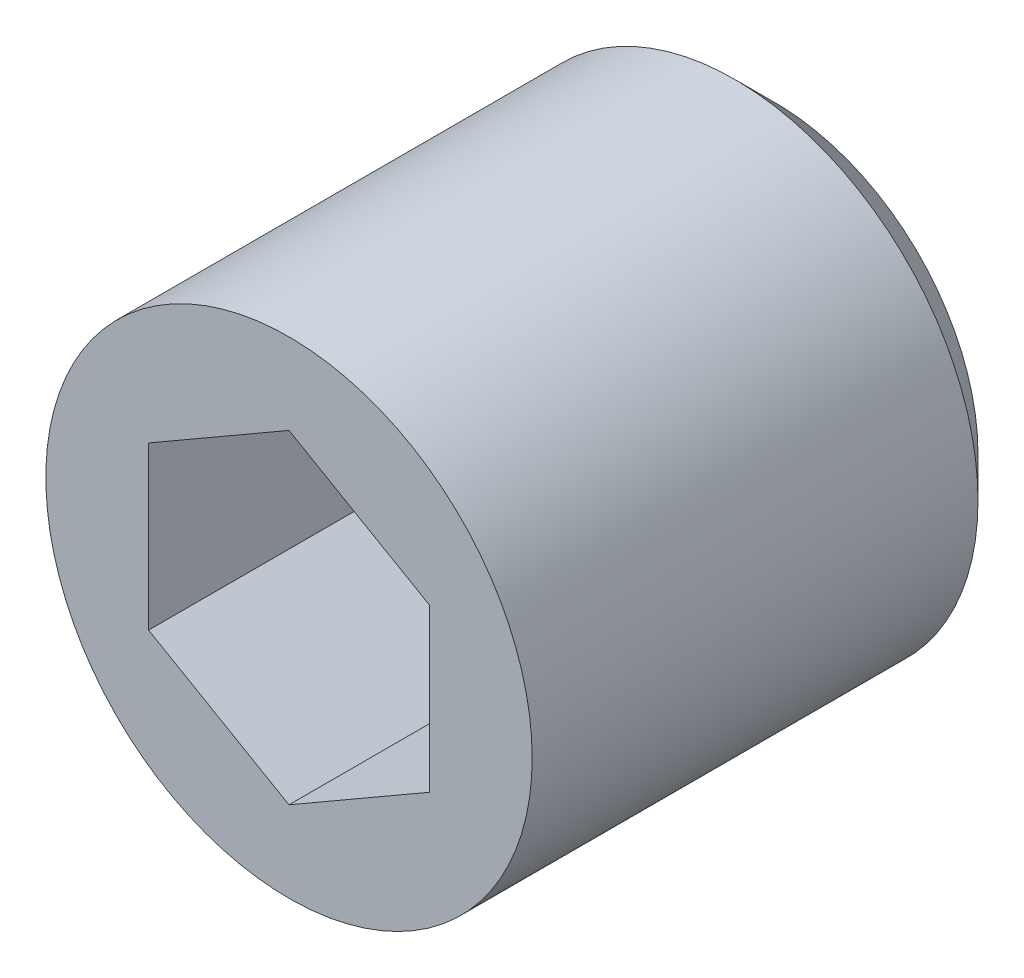
ISO-10303-21;
HEADER;
FILE_DESCRIPTION(('STEP AP214'),'2;1');
FILE_NAME('part.step','',(''),(''),'','','');
FILE_SCHEMA(('AUTOMOTIVE_DESIGN { 1 0 10303 214 1 1 1 1 }'));
ENDSEC;
DATA;
#1=APPLICATION_CONTEXT('core data for automotive mechanical design processes');
#2=APPLICATION_PROTOCOL_DEFINITION('international standard','automotive_design',2000,#1);
#3=PRODUCT_CONTEXT('',#1,'mechanical');
#4=PRODUCT('Part','Part','',(#3));
#5=PRODUCT_RELATED_PRODUCT_CATEGORY('part','',(#4));
#6=PRODUCT_DEFINITION_FORMATION('','',#4);
#7=PRODUCT_DEFINITION_CONTEXT('part definition',#1,'design');
#8=PRODUCT_DEFINITION('design','',#6,#7);
#9=PRODUCT_DEFINITION_SHAPE('','',#8);
#10=(LENGTH_UNIT() NAMED_UNIT(*) SI_UNIT(.MILLI.,.METRE.));
#11=(NAMED_UNIT(*) PLANE_ANGLE_UNIT() SI_UNIT($,.RADIAN.));
#12=(NAMED_UNIT(*) SI_UNIT($,.STERADIAN.) SOLID_ANGLE_UNIT());
#13=UNCERTAINTY_MEASURE_WITH_UNIT(LENGTH_MEASURE(1.E-05),#10,'distance_accuracy_value','');
#14=(GEOMETRIC_REPRESENTATION_CONTEXT(3) GLOBAL_UNCERTAINTY_ASSIGNED_CONTEXT((#13)) GLOBAL_UNIT_ASSIGNED_CONTEXT((#10,
#11,#12)) REPRESENTATION_CONTEXT('',''));
#15=CARTESIAN_POINT('',(0.,0.,0.));
#16=DIRECTION('',(0.,0.,1.));
#17=DIRECTION('',(1.,0.,0.));
#18=AXIS2_PLACEMENT_3D('',#15,#16,#17);
#19=CARTESIAN_POINT('',(0.,0.,6.));
#20=DIRECTION('',(0.,0.,-1.));
#21=DIRECTION('',(-1.,0.,0.));
#22=AXIS2_PLACEMENT_3D('',#19,#20,#21);
#23=CYLINDRICAL_SURFACE('',#22,3.);
#24=CARTESIAN_POINT('',(0.,0.,6.));
#25=DIRECTION('',(0.,0.,1.));
#26=DIRECTION('',(1.,0.,0.));
#27=AXIS2_PLACEMENT_3D('',#24,#25,#26);
#28=CIRCLE('',#27,3.);
#29=CARTESIAN_POINT('',(3.,0.,6.));
#30=VERTEX_POINT('',#29);
#31=EDGE_CURVE('E196',#30,#30,#28,.T.);
#32=ORIENTED_EDGE('',*,*,#31,.F.);
#33=EDGE_LOOP('',(#32));
#34=FACE_BOUND('',#33,.T.);
#35=CARTESIAN_POINT('',(0.,0.,0.5));
#36=DIRECTION('',(0.,0.,1.));
#37=DIRECTION('',(1.,0.,0.));
#38=AXIS2_PLACEMENT_3D('',#35,#36,#37);
#39=CIRCLE('',#38,3.);
#40=CARTESIAN_POINT('',(3.,0.,0.5));
#41=VERTEX_POINT('',#40);
#42=EDGE_CURVE('E66',#41,#41,#39,.T.);
#43=ORIENTED_EDGE('',*,*,#42,.T.);
#44=EDGE_LOOP('',(#43));
#45=FACE_BOUND('',#44,.T.);
#46=ADVANCED_FACE('F55',(#34,#45),#23,.T.);
#47=CARTESIAN_POINT('',(0.,0.,6.));
#48=DIRECTION('',(0.,0.,1.));
#49=DIRECTION('',(1.,0.,0.));
#50=AXIS2_PLACEMENT_3D('',#47,#48,#49);
#51=PLANE('',#50);
#52=DIRECTION('',(0.,1.,0.));
#53=VECTOR('',#52,1.);
#54=CARTESIAN_POINT('',(1.73205080756883,1.00000000000007,6.));
#55=LINE('',#54,#53);
#56=CARTESIAN_POINT('',(1.732050807569,-0.99999999999978,6.));
#57=VERTEX_POINT('',#56);
#58=CARTESIAN_POINT('',(1.73205080756883,1.00000000000007,6.));
#59=VERTEX_POINT('',#58);
#60=EDGE_CURVE('E126',#57,#59,#55,.T.);
#61=ORIENTED_EDGE('',*,*,#60,.F.);
#62=DIRECTION('',(0.866025403784428,0.500000000000019,0.));
#63=VECTOR('',#62,1.);
#64=CARTESIAN_POINT('',(1.73205080756888,-0.999999999999852,6.));
#65=LINE('',#64,#63);
#66=CARTESIAN_POINT('',(3.38162657598229E-13,-2.,6.));
#67=VERTEX_POINT('',#66);
#68=EDGE_CURVE('E131',#67,#57,#65,.T.);
#69=ORIENTED_EDGE('',*,*,#68,.F.);
#70=DIRECTION('',(0.866025403784449,-0.499999999999981,0.));
#71=VECTOR('',#70,1.);
#72=CARTESIAN_POINT('',(0.,-1.99999999999985,6.));
#73=LINE('',#72,#71);
#74=CARTESIAN_POINT('',(-1.73205080756875,-1.00000000000022,6.));
#75=VERTEX_POINT('',#74);
#76=EDGE_CURVE('E348',#75,#67,#73,.T.);
#77=ORIENTED_EDGE('',*,*,#76,.F.);
#78=DIRECTION('',(0.,-1.,0.));
#79=VECTOR('',#78,1.);
#80=CARTESIAN_POINT('',(-1.73205080756875,-0.999999999999928,6.));
#81=LINE('',#80,#79);
#82=CARTESIAN_POINT('',(-1.73205080756879,1.00000000000014,6.));
#83=VERTEX_POINT('',#82);
#84=EDGE_CURVE('E345',#83,#75,#81,.T.);
#85=ORIENTED_EDGE('',*,*,#84,.F.);
#86=DIRECTION('',(-0.866025403784428,-0.500000000000019,0.));
#87=VECTOR('',#86,1.);
#88=CARTESIAN_POINT('',(-1.73205080756879,0.999999999999998,6.));
#89=LINE('',#88,#87);
#90=CARTESIAN_POINT('',(0.,2.,6.));
#91=VERTEX_POINT('',#90);
#92=EDGE_CURVE('E137',#91,#83,#89,.T.);
#93=ORIENTED_EDGE('',*,*,#92,.F.);
#94=DIRECTION('',(-0.866025403784449,0.499999999999982,0.));
#95=VECTOR('',#94,1.);
#96=CARTESIAN_POINT('',(0.,2.,6.));
#97=LINE('',#96,#95);
#98=EDGE_CURVE('E119',#59,#91,#97,.T.);
#99=ORIENTED_EDGE('',*,*,#98,.F.);
#100=EDGE_LOOP('',(#61,#69,#77,#85,#93,#99));
#101=FACE_BOUND('',#100,.T.);
#102=ORIENTED_EDGE('',*,*,#31,.T.);
#103=EDGE_LOOP('',(#102));
#104=FACE_BOUND('',#103,.T.);
#105=ADVANCED_FACE('F133',(#101,#104),#51,.T.);
#106=CARTESIAN_POINT('',(0.,0.,0.));
#107=DIRECTION('',(0.,0.,1.));
#108=DIRECTION('',(1.,0.,0.));
#109=AXIS2_PLACEMENT_3D('',#106,#107,#108);
#110=PLANE('',#109);
#111=CARTESIAN_POINT('',(0.,0.,0.));
#112=DIRECTION('',(0.,0.,-1.));
#113=DIRECTION('',(-1.,0.,0.));
#114=AXIS2_PLACEMENT_3D('',#111,#112,#113);
#115=CIRCLE('',#114,0.49999999999999);
#116=CARTESIAN_POINT('',(-0.49999999999999,0.,0.));
#117=VERTEX_POINT('',#116);
#118=EDGE_CURVE('E356',#117,#117,#115,.T.);
#119=ORIENTED_EDGE('',*,*,#118,.F.);
#120=EDGE_LOOP('',(#119));
#121=FACE_BOUND('',#120,.T.);
#122=CARTESIAN_POINT('',(0.,0.,0.));
#123=DIRECTION('',(0.,0.,1.));
#124=DIRECTION('',(1.,0.,0.));
#125=AXIS2_PLACEMENT_3D('',#122,#123,#124);
#126=CIRCLE('',#125,2.5);
#127=CARTESIAN_POINT('',(2.5,0.,0.));
#128=VERTEX_POINT('',#127);
#129=EDGE_CURVE('E11',#128,#128,#126,.F.);
#130=ORIENTED_EDGE('',*,*,#129,.T.);
#131=EDGE_LOOP('',(#130));
#132=FACE_BOUND('',#131,.T.);
#133=ADVANCED_FACE('F212',(#121,#132),#110,.F.);
#134=CARTESIAN_POINT('',(0.,0.,0.5));
#135=DIRECTION('',(0.,0.,1.));
#136=DIRECTION('',(1.,0.,0.));
#137=AXIS2_PLACEMENT_3D('',#134,#135,#136);
#138=CONICAL_SURFACE('',#137,3.,0.78539816339745);
#139=ORIENTED_EDGE('',*,*,#129,.F.);
#140=EDGE_LOOP('',(#139));
#141=FACE_BOUND('',#140,.T.);
#142=ORIENTED_EDGE('',*,*,#42,.F.);
#143=EDGE_LOOP('',(#142));
#144=FACE_BOUND('',#143,.T.);
#145=ADVANCED_FACE('F58',(#141,#144),#138,.T.);
#146=CARTESIAN_POINT('',(-1.73205080756879,0.999999999999998,1.));
#147=DIRECTION('',(-0.500000000000019,0.866025403784428,0.));
#148=DIRECTION('',(-0.866025403784428,-0.500000000000019,0.));
#149=AXIS2_PLACEMENT_3D('',#146,#147,#148);
#150=PLANE('',#149);
#151=DIRECTION('',(0.,0.,1.));
#152=VECTOR('',#151,1.);
#153=CARTESIAN_POINT('',(-1.73205080756879,0.999999999999998,1.));
#154=LINE('',#153,#152);
#155=CARTESIAN_POINT('',(-1.73205080756879,0.999999999999998,2.20172123805512));
#156=VERTEX_POINT('',#155);
#157=EDGE_CURVE('E139',#156,#83,#154,.T.);
#158=ORIENTED_EDGE('',*,*,#157,.F.);
#159=CARTESIAN_POINT('',(-1.73225080756879,0.999884529946161,2.20179062547136));
#160=CARTESIAN_POINT('',(-1.65585869506531,1.04398953666401,2.17527809981284));
#161=CARTESIAN_POINT('',(-1.57875234700642,1.08850690747204,2.1511545571861));
#162=CARTESIAN_POINT('',(-1.42308848480957,1.1783794802145,2.10905774439611));
#163=CARTESIAN_POINT('',(-1.344527665323,1.22373659049283,2.0911009493176));
#164=CARTESIAN_POINT('',(-1.1884614235333,1.31384147720153,2.06324453906673));
#165=CARTESIAN_POINT('',(-1.11098424323894,1.35857294810054,2.0531416615811));
#166=CARTESIAN_POINT('',(-0.955643482903193,1.4482589778965,2.04120502805797));
#167=CARTESIAN_POINT('',(-0.877780572148025,1.49321315038089,2.03936003806692));
#168=CARTESIAN_POINT('',(-0.732972789409119,1.57681796272595,2.04377012137146));
#169=CARTESIAN_POINT('',(-0.666000968664977,1.6154841614607,2.04894473879539));
#170=CARTESIAN_POINT('',(-0.532531889745962,1.69254257010309,2.06515599219432));
#171=CARTESIAN_POINT('',(-0.466035179521504,1.73093446365141,2.07619854664063));
#172=CARTESIAN_POINT('',(-0.332276115088667,1.80816029550827,2.10373248400018));
#173=CARTESIAN_POINT('',(-0.265033386698939,1.84698290284512,2.12034766613401));
#174=CARTESIAN_POINT('',(-0.131626070284099,1.9240056528891,2.15799136206221));
#175=CARTESIAN_POINT('',(-0.0654594819445477,1.9622069504783,2.17901034934071));
#176=CARTESIAN_POINT('',(0.00020000000000008,2.00011547005384,2.20179062547141));
#177=B_SPLINE_CURVE_WITH_KNOTS('',3,(#159,#160,#161,#162,#163,#164,#165,#166,#167,#168,#169,
#170,#171,#172,#173,#174,#175,#176),.UNSPECIFIED.,.F.,.F.,(4,2,2,2,2,2,2,2,4),(0.,
0.276446720337437,0.553626352756078,0.823368694697328,1.09274396990612,1.3250241213926,
1.55753899933276,1.79560530555188,2.03316183691621),.UNSPECIFIED.);
#178=CARTESIAN_POINT('',(0.,2.,2.20172123805512));
#179=VERTEX_POINT('',#178);
#180=EDGE_CURVE('E187',#156,#179,#177,.T.);
#181=ORIENTED_EDGE('',*,*,#180,.T.);
#182=DIRECTION('',(0.,0.,1.));
#183=VECTOR('',#182,1.);
#184=CARTESIAN_POINT('',(0.,2.,1.));
#185=LINE('',#184,#183);
#186=EDGE_CURVE('E123',#179,#91,#185,.T.);
#187=ORIENTED_EDGE('',*,*,#186,.T.);
#188=ORIENTED_EDGE('',*,*,#92,.T.);
#189=EDGE_LOOP('',(#158,#181,#187,#188));
#190=FACE_BOUND('',#189,.T.);
#191=ADVANCED_FACE('F182',(#190),#150,.F.);
#192=CARTESIAN_POINT('',(0.,2.,1.));
#193=DIRECTION('',(0.499999999999982,0.866025403784449,0.));
#194=DIRECTION('',(-0.866025403784449,0.499999999999982,0.));
#195=AXIS2_PLACEMENT_3D('',#192,#193,#194);
#196=PLANE('',#195);
#197=ORIENTED_EDGE('',*,*,#186,.F.);
#198=CARTESIAN_POINT('',(-0.000200000000000073,2.00011547005384,2.20179062547141));
#199=CARTESIAN_POINT('',(0.0761921125034905,1.95601046333599,2.17527809981288));
#200=CARTESIAN_POINT('',(0.153298460562383,1.91149309252796,2.15115455718614));
#201=CARTESIAN_POINT('',(0.30896232275924,1.82162051978551,2.10905774439615));
#202=CARTESIAN_POINT('',(0.387523142245817,1.77626340950718,2.09110094931764));
#203=CARTESIAN_POINT('',(0.543589384035522,1.68615852279848,2.06324453906676));
#204=CARTESIAN_POINT('',(0.621066564329894,1.64142705189948,2.05314166158113));
#205=CARTESIAN_POINT('',(0.776407324665645,1.55174102210351,2.041205028058));
#206=CARTESIAN_POINT('',(0.854270235420819,1.50678684961913,2.03936003806695));
#207=CARTESIAN_POINT('',(0.999078018159728,1.42318203727407,2.04377012137148));
#208=CARTESIAN_POINT('',(1.06604983890387,1.38451583853932,2.04894473879542));
#209=CARTESIAN_POINT('',(1.19951891782288,1.30745742989694,2.06515599219434));
#210=CARTESIAN_POINT('',(1.26601562804734,1.26906553634863,2.07619854664064));
#211=CARTESIAN_POINT('',(1.39977469248017,1.19183970449179,2.10373248400019));
#212=CARTESIAN_POINT('',(1.4670174208699,1.15301709715493,2.12034766613402));
#213=CARTESIAN_POINT('',(1.60042473728474,1.07599434711097,2.15799136206221));
#214=CARTESIAN_POINT('',(1.66659132562429,1.03779304952177,2.17901034934071));
#215=CARTESIAN_POINT('',(1.73225080756883,0.999884529946236,2.20179062547141));
#216=B_SPLINE_CURVE_WITH_KNOTS('',3,(#198,#199,#200,#201,#202,#203,#204,#205,#206,#207,#208,
#209,#210,#211,#212,#213,#214,#215),.UNSPECIFIED.,.F.,.F.,(4,2,2,2,2,2,2,2,4),(0.,
0.276446720337447,0.553626352756098,0.823368694697358,1.09274396990616,1.32502412139263,
1.55753899933278,1.79560530555189,2.03316183691621),.UNSPECIFIED.);
#217=CARTESIAN_POINT('',(1.73205080756883,1.00000000000007,2.20172123805512));
#218=VERTEX_POINT('',#217);
#219=EDGE_CURVE('E121',#179,#218,#216,.T.);
#220=ORIENTED_EDGE('',*,*,#219,.T.);
#221=DIRECTION('',(0.,0.,1.));
#222=VECTOR('',#221,1.);
#223=CARTESIAN_POINT('',(1.73205080756883,1.00000000000007,1.));
#224=LINE('',#223,#222);
#225=EDGE_CURVE('E115',#218,#59,#224,.T.);
#226=ORIENTED_EDGE('',*,*,#225,.T.);
#227=ORIENTED_EDGE('',*,*,#98,.T.);
#228=EDGE_LOOP('',(#197,#220,#226,#227));
#229=FACE_BOUND('',#228,.T.);
#230=ADVANCED_FACE('F117',(#229),#196,.F.);
#231=CARTESIAN_POINT('',(1.73205080756883,1.00000000000007,1.));
#232=DIRECTION('',(1.,0.,0.));
#233=DIRECTION('',(0.,1.,0.));
#234=AXIS2_PLACEMENT_3D('',#231,#232,#233);
#235=PLANE('',#234);
#236=ORIENTED_EDGE('',*,*,#225,.F.);
#237=CARTESIAN_POINT('',(1.73205080756878,3.33346679443067,3.25718958731224));
#238=CARTESIAN_POINT('',(1.73205080756879,3.25844164966677,3.21719094623009));
#239=CARTESIAN_POINT('',(1.73205080756879,3.18329986650545,3.17740999402158));
#240=CARTESIAN_POINT('',(1.73205080756879,3.03273310421331,3.09838213845979));
#241=CARTESIAN_POINT('',(1.73205080756879,2.95730811619734,3.05913525204374));
#242=CARTESIAN_POINT('',(1.7320508075688,2.73031890787232,2.9422333187297));
#243=CARTESIAN_POINT('',(1.7320508075688,2.57826019976238,2.86553489630714));
#244=CARTESIAN_POINT('',(1.73205080756881,2.26449980779083,2.71209921136084));
#245=CARTESIAN_POINT('',(1.73205080756881,2.10270077734059,2.63555805068531));
#246=CARTESIAN_POINT('',(1.73205080756882,1.8577711778404,2.52580757328307));
#247=CARTESIAN_POINT('',(1.73205080756882,1.77577489433917,2.49007511912805));
#248=CARTESIAN_POINT('',(1.73205080756882,1.61086461083307,2.4208032590496));
#249=CARTESIAN_POINT('',(1.73205080756882,1.52795068817222,2.38726366992001));
#250=CARTESIAN_POINT('',(1.73205080756883,1.34584224391319,2.31717969627091));
#251=CARTESIAN_POINT('',(1.73205080756883,1.24642846278296,2.28119766131828));
#252=CARTESIAN_POINT('',(1.73205080756883,1.04574870785268,2.2146587501786));
#253=CARTESIAN_POINT('',(1.73205080756884,0.944482388284571,2.18410289839843));
#254=CARTESIAN_POINT('',(1.73205080756884,0.741912940136763,2.13088179417551));
#255=CARTESIAN_POINT('',(1.73205080756884,0.640647373993332,2.10807712235862));
#256=CARTESIAN_POINT('',(1.73205080756885,0.436512896211944,2.071670484848));
#257=CARTESIAN_POINT('',(1.73205080756885,0.333645525818083,2.05806017207513));
#258=CARTESIAN_POINT('',(1.73205080756885,0.125281487583535,2.04156833201794));
#259=CARTESIAN_POINT('',(1.73205080756886,0.0197696217322184,2.03887008319113));
#260=CARTESIAN_POINT('',(1.73205080756886,-0.190903817949407,2.04511056856339));
#261=CARTESIAN_POINT('',(1.73205080756886,-0.296065351929776,2.05405058414455));
#262=CARTESIAN_POINT('',(1.73205080756887,-0.50704901890891,2.08259717912958));
#263=CARTESIAN_POINT('',(1.73205080756887,-0.612841177289705,2.10241674484601));
#264=CARTESIAN_POINT('',(1.73205080756887,-0.822444419101405,2.15061386291395));
#265=CARTESIAN_POINT('',(1.73205080756888,-0.926254565257028,2.17899536251603));
#266=CARTESIAN_POINT('',(1.73205080756888,-1.13303750446661,2.24245673135155));
#267=CARTESIAN_POINT('',(1.73205080756888,-1.23598789610978,2.27760806427984));
#268=CARTESIAN_POINT('',(1.73205080756889,-1.44017637137564,2.35261461218983));
#269=CARTESIAN_POINT('',(1.73205080756889,-1.54141383362866,2.39247149399817));
#270=CARTESIAN_POINT('',(1.73205080756889,-1.74262416308844,2.4756487664073));
#271=CARTESIAN_POINT('',(1.7320508075689,-1.84259485181795,2.51897437700664));
#272=CARTESIAN_POINT('',(1.7320508075689,-2.04141485120877,2.60813031327321));
#273=CARTESIAN_POINT('',(1.7320508075689,-2.14026407628232,2.65396082857729));
#274=CARTESIAN_POINT('',(1.73205080756891,-2.33132474692604,2.74475953245313));
#275=CARTESIAN_POINT('',(1.73205080756891,-2.42358675638566,2.78962181782175));
#276=CARTESIAN_POINT('',(1.73205080756891,-2.60747927333686,2.8806296846609));
#277=CARTESIAN_POINT('',(1.73205080756891,-2.69910975207293,2.92677532409096));
#278=CARTESIAN_POINT('',(1.73205080756892,-2.88143495576904,3.01985356256181));
#279=CARTESIAN_POINT('',(1.73205080756892,-2.97213204849723,3.06678153565385));
#280=CARTESIAN_POINT('',(1.73205080756892,-3.15309666800495,3.16143441579138));
#281=CARTESIAN_POINT('',(1.73205080756893,-3.24336424238468,3.20915923175499));
#282=CARTESIAN_POINT('',(1.73205080756893,-3.33346679443045,3.25718958731216));
#283=B_SPLINE_CURVE_WITH_KNOTS('',3,(#237,#238,#239,#240,#241,#242,#243,#244,#245,#246,#247,
#248,#249,#250,#251,#252,#253,#254,#255,#256,#257,#258,#259,#260,#261,#262,#263,#264,#265,#266,
#267,#268,#269,#270,#271,#272,#273,#274,#275,#276,#277,#278,#279,#280,#281,#282),.UNSPECIFIED.,
.F.,.F.,(4,2,2,2,2,2,2,2,2,2,2,2,2,2,2,2,2,2,2,2,2,2,4),(0.,0.255064893469544,0.510137857236864,
1.02103184936294,1.55788873670757,1.82619609033913,2.09448099911587,2.41154291715878,
2.72866462970134,3.03973610860272,3.35052480103987,3.66651233378617,3.98253465995119,
4.30497650751034,4.62756723602429,4.95377109404937,5.28009085054615,5.60691125631372,
5.93375643878127,6.24151711181073,6.54929170673981,6.85564305298367,7.16195961873725),.UNSPECIFIED.);
#284=CARTESIAN_POINT('',(1.732050807569,-0.99999999999978,2.20172123805512));
#285=VERTEX_POINT('',#284);
#286=EDGE_CURVE('E327',#218,#285,#283,.T.);
#287=ORIENTED_EDGE('',*,*,#286,.T.);
#288=DIRECTION('',(0.,0.,1.));
#289=VECTOR('',#288,1.);
#290=CARTESIAN_POINT('',(1.73205080756888,-0.999999999999852,1.));
#291=LINE('',#290,#289);
#292=EDGE_CURVE('E73',#285,#57,#291,.T.);
#293=ORIENTED_EDGE('',*,*,#292,.T.);
#294=ORIENTED_EDGE('',*,*,#60,.T.);
#295=EDGE_LOOP('',(#236,#287,#293,#294));
#296=FACE_BOUND('',#295,.T.);
#297=ADVANCED_FACE('F127',(#296),#235,.F.);
#298=CARTESIAN_POINT('',(1.73205080756888,-0.999999999999852,1.));
#299=DIRECTION('',(0.500000000000019,-0.866025403784428,0.));
#300=DIRECTION('',(0.866025403784428,0.500000000000019,0.));
#301=AXIS2_PLACEMENT_3D('',#298,#299,#300);
#302=PLANE('',#301);
#303=ORIENTED_EDGE('',*,*,#292,.F.);
#304=CARTESIAN_POINT('',(1.73225080756888,-0.999884529946015,2.20179062547136));
#305=CARTESIAN_POINT('',(1.65585869506539,-1.04398953666387,2.17527809981284));
#306=CARTESIAN_POINT('',(1.57875234700651,-1.0885069074719,2.15115455718609));
#307=CARTESIAN_POINT('',(1.42308848480966,-1.17837948021435,2.1090577443961));
#308=CARTESIAN_POINT('',(1.34452766532309,-1.22373659049268,2.09110094931758));
#309=CARTESIAN_POINT('',(1.18846142353339,-1.31384147720138,2.0632445390667));
#310=CARTESIAN_POINT('',(1.11098424323903,-1.35857294810039,2.05314166158106));
#311=CARTESIAN_POINT('',(0.955643482903286,-1.44825897789635,2.04120502805793));
#312=CARTESIAN_POINT('',(0.877780572148117,-1.49321315038074,2.03936003806687));
#313=CARTESIAN_POINT('',(0.732972789409212,-1.5768179627258,2.0437701213714));
#314=CARTESIAN_POINT('',(0.66600096866507,-1.61548416146055,2.04894473879533));
#315=CARTESIAN_POINT('',(0.532531889746053,-1.69254257010294,2.06515599219425));
#316=CARTESIAN_POINT('',(0.466035179521595,-1.73093446365126,2.07619854664056));
#317=CARTESIAN_POINT('',(0.332276115088757,-1.80816029550812,2.1037324840001));
#318=CARTESIAN_POINT('',(0.265033386699028,-1.84698290284497,2.12034766613392));
#319=CARTESIAN_POINT('',(0.131626070284187,-1.92400565288895,2.15799136206212));
#320=CARTESIAN_POINT('',(0.0654594819446342,-1.96220695047815,2.17901034934063));
#321=CARTESIAN_POINT('',(-0.000199999999914301,-2.00011547005369,2.20179062547132));
#322=B_SPLINE_CURVE_WITH_KNOTS('',3,(#304,#305,#306,#307,#308,#309,#310,#311,#312,#313,#314,
#315,#316,#317,#318,#319,#320,#321),.UNSPECIFIED.,.F.,.F.,(4,2,2,2,2,2,2,2,4),(0.,
0.276446720337436,0.553626352756078,0.823368694697327,1.09274396990612,1.3250241213926,
1.55753899933276,1.79560530555188,2.03316183691621),.UNSPECIFIED.);
#323=CARTESIAN_POINT('',(3.38162657598229E-13,-2.,2.20172123805512));
#324=VERTEX_POINT('',#323);
#325=EDGE_CURVE('E333',#285,#324,#322,.T.);
#326=ORIENTED_EDGE('',*,*,#325,.T.);
#327=DIRECTION('',(0.,0.,1.));
#328=VECTOR('',#327,1.);
#329=CARTESIAN_POINT('',(0.,-1.99999999999985,1.));
#330=LINE('',#329,#328);
#331=EDGE_CURVE('E80',#324,#67,#330,.T.);
#332=ORIENTED_EDGE('',*,*,#331,.T.);
#333=ORIENTED_EDGE('',*,*,#68,.T.);
#334=EDGE_LOOP('',(#303,#326,#332,#333));
#335=FACE_BOUND('',#334,.T.);
#336=ADVANCED_FACE('F251',(#335),#302,.F.);
#337=CARTESIAN_POINT('',(0.,-1.99999999999985,1.));
#338=DIRECTION('',(-0.499999999999981,-0.86602540378445,0.));
#339=DIRECTION('',(0.86602540378445,-0.499999999999981,0.));
#340=AXIS2_PLACEMENT_3D('',#337,#338,#339);
#341=PLANE('',#340);
#342=ORIENTED_EDGE('',*,*,#331,.F.);
#343=CARTESIAN_POINT('',(0.000200000000085744,-2.00011547005369,2.20179062547132));
#344=CARTESIAN_POINT('',(-0.0761921125033985,-1.95601046333584,2.1752780998128));
#345=CARTESIAN_POINT('',(-0.153298460562285,-1.91149309252782,2.15115455718605));
#346=CARTESIAN_POINT('',(-0.30896232275913,-1.82162051978538,2.10905774439606));
#347=CARTESIAN_POINT('',(-0.387523142245701,-1.77626340950705,2.09110094931755));
#348=CARTESIAN_POINT('',(-0.543589384035394,-1.68615852279836,2.06324453906667));
#349=CARTESIAN_POINT('',(-0.62106656432976,-1.64142705189936,2.05314166158103));
#350=CARTESIAN_POINT('',(-0.776407324665499,-1.5517410221034,2.0412050280579));
#351=CARTESIAN_POINT('',(-0.854270235420667,-1.50678684961902,2.03936003806685));
#352=CARTESIAN_POINT('',(-0.999078018159576,-1.42318203727396,2.04377012137138));
#353=CARTESIAN_POINT('',(-1.06604983890372,-1.38451583853921,2.04894473879531));
#354=CARTESIAN_POINT('',(-1.19951891782275,-1.30745742989683,2.06515599219423));
#355=CARTESIAN_POINT('',(-1.26601562804721,-1.26906553634851,2.07619854664054));
#356=CARTESIAN_POINT('',(-1.39977469248006,-1.19183970449166,2.10373248400009));
#357=CARTESIAN_POINT('',(-1.46701742086979,-1.1530170971548,2.12034766613391));
#358=CARTESIAN_POINT('',(-1.60042473728464,-1.07599434711083,2.15799136206212));
#359=CARTESIAN_POINT('',(-1.6665913256242,-1.03779304952163,2.17901034934062));
#360=CARTESIAN_POINT('',(-1.73225080756875,-0.99988452994609,2.20179062547132));
#361=B_SPLINE_CURVE_WITH_KNOTS('',3,(#343,#344,#345,#346,#347,#348,#349,#350,#351,#352,#353,
#354,#355,#356,#357,#358,#359,#360),.UNSPECIFIED.,.F.,.F.,(4,2,2,2,2,2,2,2,4),(0.,
0.276446720337426,0.553626352756058,0.823368694697297,1.09274396990608,1.32502412139257,
1.55753899933274,1.79560530555187,2.03316183691621),.UNSPECIFIED.);
#362=CARTESIAN_POINT('',(-1.73205080756875,-1.00000000000022,2.20172123805512));
#363=VERTEX_POINT('',#362);
#364=EDGE_CURVE('E164',#324,#363,#361,.T.);
#365=ORIENTED_EDGE('',*,*,#364,.T.);
#366=DIRECTION('',(0.,0.,1.));
#367=VECTOR('',#366,1.);
#368=CARTESIAN_POINT('',(-1.73205080756875,-0.999999999999928,1.));
#369=LINE('',#368,#367);
#370=EDGE_CURVE('E142',#363,#75,#369,.T.);
#371=ORIENTED_EDGE('',*,*,#370,.T.);
#372=ORIENTED_EDGE('',*,*,#76,.T.);
#373=EDGE_LOOP('',(#342,#365,#371,#372));
#374=FACE_BOUND('',#373,.T.);
#375=ADVANCED_FACE('F178',(#374),#341,.F.);
#376=CARTESIAN_POINT('',(-1.73205080756875,-0.999999999999928,1.));
#377=DIRECTION('',(-1.,0.,0.));
#378=DIRECTION('',(0.,-1.,0.));
#379=AXIS2_PLACEMENT_3D('',#376,#377,#378);
#380=PLANE('',#379);
#381=ORIENTED_EDGE('',*,*,#370,.F.);
#382=CARTESIAN_POINT('',(-1.7320508075687,-3.33346679443052,3.25718958731214));
#383=CARTESIAN_POINT('',(-1.7320508075687,-3.25844164966663,3.21719094622999));
#384=CARTESIAN_POINT('',(-1.7320508075687,-3.18329986650531,3.17740999402148));
#385=CARTESIAN_POINT('',(-1.73205080756871,-3.03273310421318,3.0983821384597));
#386=CARTESIAN_POINT('',(-1.73205080756871,-2.95730811619721,3.05913525204365));
#387=CARTESIAN_POINT('',(-1.73205080756871,-2.7303189078722,2.94223331872961));
#388=CARTESIAN_POINT('',(-1.73205080756871,-2.57826019976227,2.86553489630706));
#389=CARTESIAN_POINT('',(-1.73205080756872,-2.26449980779073,2.71209921136076));
#390=CARTESIAN_POINT('',(-1.73205080756873,-2.1027007773405,2.63555805068524));
#391=CARTESIAN_POINT('',(-1.73205080756873,-1.85777117784032,2.525807573283));
#392=CARTESIAN_POINT('',(-1.73205080756873,-1.77577489433909,2.49007511912799));
#393=CARTESIAN_POINT('',(-1.73205080756874,-1.610864610833,2.42080325904954));
#394=CARTESIAN_POINT('',(-1.73205080756874,-1.52795068817216,2.38726366991994));
#395=CARTESIAN_POINT('',(-1.73205080756874,-1.34584224391313,2.31717969627085));
#396=CARTESIAN_POINT('',(-1.73205080756874,-1.24642846278291,2.28119766131822));
#397=CARTESIAN_POINT('',(-1.73205080756875,-1.04574870785264,2.21465875017854));
#398=CARTESIAN_POINT('',(-1.73205080756875,-0.944482388284533,2.18410289839838));
#399=CARTESIAN_POINT('',(-1.73205080756876,-0.741912940136735,2.13088179417546));
#400=CARTESIAN_POINT('',(-1.73205080756876,-0.640647373993309,2.10807712235857));
#401=CARTESIAN_POINT('',(-1.73205080756876,-0.43651289621193,2.07167048484795));
#402=CARTESIAN_POINT('',(-1.73205080756876,-0.333645525818074,2.05806017207508));
#403=CARTESIAN_POINT('',(-1.73205080756877,-0.125281487583536,2.04156833201789));
#404=CARTESIAN_POINT('',(-1.73205080756877,-0.019769621732224,2.03887008319108));
#405=CARTESIAN_POINT('',(-1.73205080756878,0.190903817949392,2.04511056856334));
#406=CARTESIAN_POINT('',(-1.73205080756878,0.296065351929756,2.0540505841445));
#407=CARTESIAN_POINT('',(-1.73205080756878,0.50704901890888,2.08259717912953));
#408=CARTESIAN_POINT('',(-1.73205080756878,0.61284117728967,2.10241674484596));
#409=CARTESIAN_POINT('',(-1.73205080756879,0.82244441910136,2.15061386291389));
#410=CARTESIAN_POINT('',(-1.73205080756879,0.926254565256979,2.17899536251597));
#411=CARTESIAN_POINT('',(-1.7320508075688,1.13303750446657,2.2424567313515));
#412=CARTESIAN_POINT('',(-1.7320508075688,1.23598789610974,2.27760806427978));
#413=CARTESIAN_POINT('',(-1.7320508075688,1.44017637137562,2.35261461218978));
#414=CARTESIAN_POINT('',(-1.73205080756881,1.54141383362866,2.39247149399813));
#415=CARTESIAN_POINT('',(-1.73205080756881,1.74262416308845,2.47564876640727));
#416=CARTESIAN_POINT('',(-1.73205080756881,1.84259485181797,2.51897437700661));
#417=CARTESIAN_POINT('',(-1.73205080756882,2.04141485120881,2.6081303132732));
#418=CARTESIAN_POINT('',(-1.73205080756882,2.14026407628236,2.65396082857728));
#419=CARTESIAN_POINT('',(-1.73205080756882,2.3313247469261,2.74475953245313));
#420=CARTESIAN_POINT('',(-1.73205080756882,2.42358675638574,2.78962181782176));
#421=CARTESIAN_POINT('',(-1.73205080756883,2.60747927333695,2.88062968466091));
#422=CARTESIAN_POINT('',(-1.73205080756883,2.69910975207302,2.92677532409098));
#423=CARTESIAN_POINT('',(-1.73205080756883,2.88143495576915,3.01985356256184));
#424=CARTESIAN_POINT('',(-1.73205080756884,2.97213204849734,3.06678153565389));
#425=CARTESIAN_POINT('',(-1.73205080756884,3.15309666800509,3.16143441579143));
#426=CARTESIAN_POINT('',(-1.73205080756884,3.24336424238482,3.20915923175504));
#427=CARTESIAN_POINT('',(-1.73205080756884,3.3334667944306,3.25718958731222));
#428=B_SPLINE_CURVE_WITH_KNOTS('',3,(#382,#383,#384,#385,#386,#387,#388,#389,#390,#391,#392,
#393,#394,#395,#396,#397,#398,#399,#400,#401,#402,#403,#404,#405,#406,#407,#408,#409,#410,#411,
#412,#413,#414,#415,#416,#417,#418,#419,#420,#421,#422,#423,#424,#425,#426,#427),.UNSPECIFIED.,
.F.,.F.,(4,2,2,2,2,2,2,2,2,2,2,2,2,2,2,2,2,2,2,2,2,2,4),(0.,0.255064893469533,0.510137857236842,
1.0210318493629,1.5578887367075,1.82619609033904,2.09448099911578,2.41154291715867,
2.72866462970122,3.03973610860258,3.35052480103972,3.66651233378601,3.98253465995101,
4.30497650751014,4.62756723602408,4.95377109404919,5.280090850546,5.6069112563136,
5.93375643878119,6.24151711181066,6.54929170673977,6.85564305298367,7.16195961873727),.UNSPECIFIED.);
#429=EDGE_CURVE('E147',#363,#156,#428,.T.);
#430=ORIENTED_EDGE('',*,*,#429,.T.);
#431=ORIENTED_EDGE('',*,*,#157,.T.);
#432=ORIENTED_EDGE('',*,*,#84,.T.);
#433=EDGE_LOOP('',(#381,#430,#431,#432));
#434=FACE_BOUND('',#433,.T.);
#435=ADVANCED_FACE('F175',(#434),#380,.F.);
#436=CARTESIAN_POINT('',(0.,0.,2.20172123805512));
#437=DIRECTION('',(0.,0.,1.));
#438=DIRECTION('',(1.,0.,0.));
#439=AXIS2_PLACEMENT_3D('',#436,#437,#438);
#440=CONICAL_SURFACE('',#439,2.,1.02974425867665);
#441=CARTESIAN_POINT('',(0.,0.,1.30043030951378));
#442=DIRECTION('',(0.,0.,1.));
#443=DIRECTION('',(1.,0.,0.));
#444=AXIS2_PLACEMENT_3D('',#441,#442,#443);
#445=CIRCLE('',#444,0.499999999999994);
#446=CARTESIAN_POINT('',(0.499999999999994,0.,1.30043030951378));
#447=VERTEX_POINT('',#446);
#448=EDGE_CURVE('E60',#447,#447,#445,.F.);
#449=ORIENTED_EDGE('',*,*,#448,.T.);
#450=EDGE_LOOP('',(#449));
#451=FACE_BOUND('',#450,.T.);
#452=ORIENTED_EDGE('',*,*,#180,.F.);
#453=ORIENTED_EDGE('',*,*,#429,.F.);
#454=ORIENTED_EDGE('',*,*,#364,.F.);
#455=ORIENTED_EDGE('',*,*,#325,.F.);
#456=ORIENTED_EDGE('',*,*,#286,.F.);
#457=ORIENTED_EDGE('',*,*,#219,.F.);
#458=EDGE_LOOP('',(#452,#453,#454,#455,#456,#457));
#459=FACE_BOUND('',#458,.T.);
#460=ADVANCED_FACE('F171',(#451,#459),#440,.F.);
#461=CARTESIAN_POINT('',(0.,0.,0.));
#462=DIRECTION('',(0.,0.,-1.));
#463=DIRECTION('',(-1.,0.,0.));
#464=AXIS2_PLACEMENT_3D('',#461,#462,#463);
#465=CYLINDRICAL_SURFACE('',#464,0.499999999999994);
#466=ORIENTED_EDGE('',*,*,#118,.T.);
#467=EDGE_LOOP('',(#466));
#468=FACE_BOUND('',#467,.T.);
#469=ORIENTED_EDGE('',*,*,#448,.F.);
#470=EDGE_LOOP('',(#469));
#471=FACE_BOUND('',#470,.T.);
#472=ADVANCED_FACE('F283',(#468,#471),#465,.F.);
#473=CLOSED_SHELL('',(#46,#105,#133,#145,#191,#230,#297,#336,#375,#435,#460,#472));
#474=MANIFOLD_SOLID_BREP('B2',#473);
#475=ADVANCED_BREP_SHAPE_REPRESENTATION('',(#18,#474),#14);
#476=SHAPE_DEFINITION_REPRESENTATION(#9,#475);
ENDSEC;
END-ISO-10303-21;
